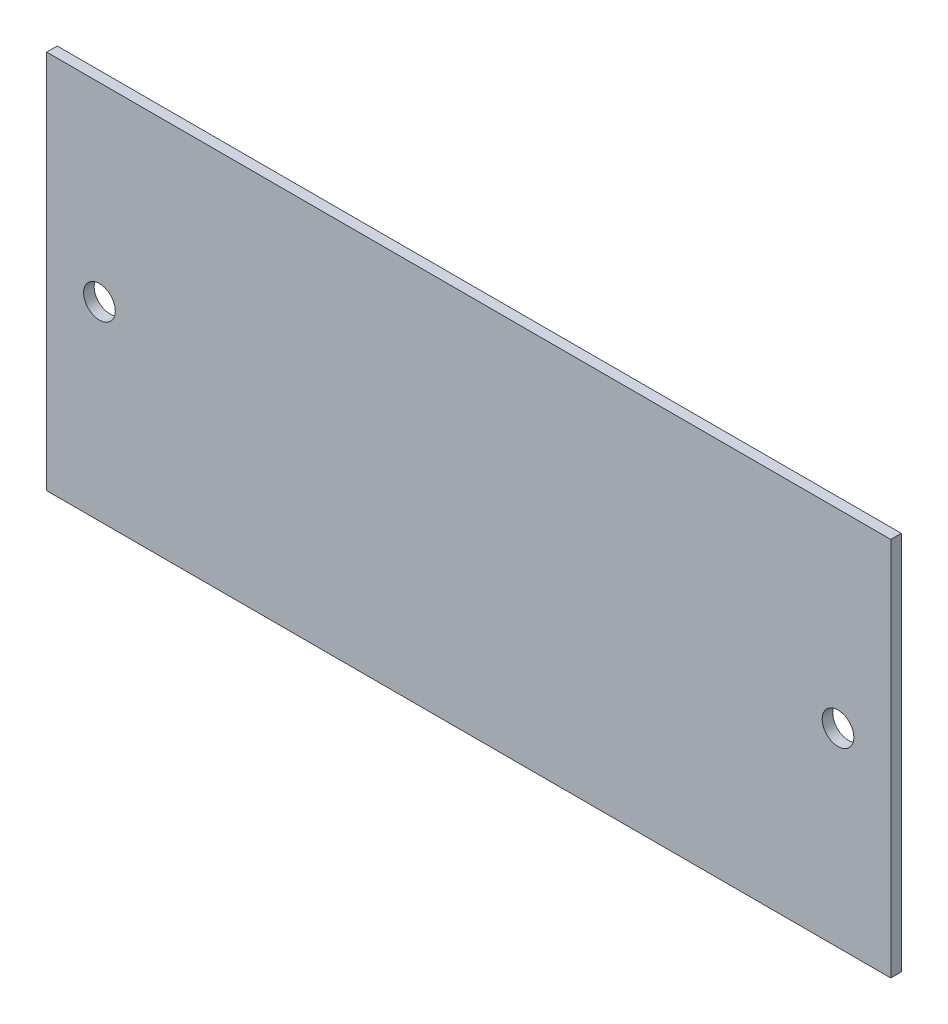
ISO-10303-21;
HEADER;
FILE_DESCRIPTION(('STEP AP214'),'2;1');
FILE_NAME('part.step','',(''),(''),'','','');
FILE_SCHEMA(('AUTOMOTIVE_DESIGN { 1 0 10303 214 1 1 1 1 }'));
ENDSEC;
DATA;
#1=APPLICATION_CONTEXT('core data for automotive mechanical design processes');
#2=APPLICATION_PROTOCOL_DEFINITION('international standard','automotive_design',2000,#1);
#3=PRODUCT_CONTEXT('',#1,'mechanical');
#4=PRODUCT('Part','Part','',(#3));
#5=PRODUCT_RELATED_PRODUCT_CATEGORY('part','',(#4));
#6=PRODUCT_DEFINITION_FORMATION('','',#4);
#7=PRODUCT_DEFINITION_CONTEXT('part definition',#1,'design');
#8=PRODUCT_DEFINITION('design','',#6,#7);
#9=PRODUCT_DEFINITION_SHAPE('','',#8);
#10=(LENGTH_UNIT() NAMED_UNIT(*) SI_UNIT(.MILLI.,.METRE.));
#11=(NAMED_UNIT(*) PLANE_ANGLE_UNIT() SI_UNIT($,.RADIAN.));
#12=(NAMED_UNIT(*) SI_UNIT($,.STERADIAN.) SOLID_ANGLE_UNIT());
#13=UNCERTAINTY_MEASURE_WITH_UNIT(LENGTH_MEASURE(1.E-05),#10,'distance_accuracy_value','');
#14=(GEOMETRIC_REPRESENTATION_CONTEXT(3) GLOBAL_UNCERTAINTY_ASSIGNED_CONTEXT((#13)) GLOBAL_UNIT_ASSIGNED_CONTEXT((#10,
#11,#12)) REPRESENTATION_CONTEXT('',''));
#15=CARTESIAN_POINT('',(0.,0.,0.));
#16=DIRECTION('',(0.,0.,1.));
#17=DIRECTION('',(1.,0.,0.));
#18=AXIS2_PLACEMENT_3D('',#15,#16,#17);
#19=CARTESIAN_POINT('',(0.,0.,1.27));
#20=DIRECTION('',(1.,0.,0.));
#21=DIRECTION('',(0.,0.,-1.));
#22=AXIS2_PLACEMENT_3D('',#19,#20,#21);
#23=PLANE('',#22);
#24=DIRECTION('',(0.,-1.,0.));
#25=VECTOR('',#24,1.);
#26=CARTESIAN_POINT('',(0.,0.,0.));
#27=LINE('',#26,#25);
#28=CARTESIAN_POINT('',(0.,45.72,0.));
#29=VERTEX_POINT('',#28);
#30=CARTESIAN_POINT('',(0.,0.,0.));
#31=VERTEX_POINT('',#30);
#32=EDGE_CURVE('E96',#29,#31,#27,.T.);
#33=ORIENTED_EDGE('',*,*,#32,.T.);
#34=DIRECTION('',(0.,0.,-1.));
#35=VECTOR('',#34,1.);
#36=CARTESIAN_POINT('',(0.,0.,1.27));
#37=LINE('',#36,#35);
#38=CARTESIAN_POINT('',(0.,0.,1.27));
#39=VERTEX_POINT('',#38);
#40=EDGE_CURVE('E11',#39,#31,#37,.T.);
#41=ORIENTED_EDGE('',*,*,#40,.F.);
#42=DIRECTION('',(0.,-1.,0.));
#43=VECTOR('',#42,1.);
#44=CARTESIAN_POINT('',(0.,0.,1.27));
#45=LINE('',#44,#43);
#46=CARTESIAN_POINT('',(0.,45.72,1.27));
#47=VERTEX_POINT('',#46);
#48=EDGE_CURVE('E84',#47,#39,#45,.T.);
#49=ORIENTED_EDGE('',*,*,#48,.F.);
#50=DIRECTION('',(0.,0.,-1.));
#51=VECTOR('',#50,1.);
#52=CARTESIAN_POINT('',(0.,45.72,1.27));
#53=LINE('',#52,#51);
#54=EDGE_CURVE('E92',#47,#29,#53,.T.);
#55=ORIENTED_EDGE('',*,*,#54,.T.);
#56=EDGE_LOOP('',(#33,#41,#49,#55));
#57=FACE_BOUND('',#56,.T.);
#58=ADVANCED_FACE('F33',(#57),#23,.F.);
#59=CARTESIAN_POINT('',(0.,0.,1.27));
#60=DIRECTION('',(0.,1.,0.));
#61=DIRECTION('',(0.,0.,1.));
#62=AXIS2_PLACEMENT_3D('',#59,#60,#61);
#63=PLANE('',#62);
#64=DIRECTION('',(1.,0.,0.));
#65=VECTOR('',#64,1.);
#66=CARTESIAN_POINT('',(0.,0.,0.));
#67=LINE('',#66,#65);
#68=CARTESIAN_POINT('',(101.6,0.,0.));
#69=VERTEX_POINT('',#68);
#70=EDGE_CURVE('E88',#31,#69,#67,.T.);
#71=ORIENTED_EDGE('',*,*,#70,.T.);
#72=DIRECTION('',(0.,0.,-1.));
#73=VECTOR('',#72,1.);
#74=CARTESIAN_POINT('',(101.6,0.,1.27));
#75=LINE('',#74,#73);
#76=CARTESIAN_POINT('',(101.6,0.,1.27));
#77=VERTEX_POINT('',#76);
#78=EDGE_CURVE('E41',#77,#69,#75,.T.);
#79=ORIENTED_EDGE('',*,*,#78,.F.);
#80=DIRECTION('',(1.,0.,0.));
#81=VECTOR('',#80,1.);
#82=CARTESIAN_POINT('',(0.,0.,1.27));
#83=LINE('',#82,#81);
#84=EDGE_CURVE('E79',#39,#77,#83,.T.);
#85=ORIENTED_EDGE('',*,*,#84,.F.);
#86=ORIENTED_EDGE('',*,*,#40,.T.);
#87=EDGE_LOOP('',(#71,#79,#85,#86));
#88=FACE_BOUND('',#87,.T.);
#89=ADVANCED_FACE('F87',(#88),#63,.F.);
#90=CARTESIAN_POINT('',(101.6,0.,1.27));
#91=DIRECTION('',(-1.,0.,0.));
#92=DIRECTION('',(0.,-1.,0.));
#93=AXIS2_PLACEMENT_3D('',#90,#91,#92);
#94=PLANE('',#93);
#95=DIRECTION('',(0.,1.,0.));
#96=VECTOR('',#95,1.);
#97=CARTESIAN_POINT('',(101.6,0.,0.));
#98=LINE('',#97,#96);
#99=CARTESIAN_POINT('',(101.6,45.72,0.));
#100=VERTEX_POINT('',#99);
#101=EDGE_CURVE('E66',#69,#100,#98,.T.);
#102=ORIENTED_EDGE('',*,*,#101,.T.);
#103=DIRECTION('',(0.,0.,-1.));
#104=VECTOR('',#103,1.);
#105=CARTESIAN_POINT('',(101.6,45.72,1.27));
#106=LINE('',#105,#104);
#107=CARTESIAN_POINT('',(101.6,45.72,1.27));
#108=VERTEX_POINT('',#107);
#109=EDGE_CURVE('E89',#108,#100,#106,.T.);
#110=ORIENTED_EDGE('',*,*,#109,.F.);
#111=DIRECTION('',(0.,1.,0.));
#112=VECTOR('',#111,1.);
#113=CARTESIAN_POINT('',(101.6,0.,1.27));
#114=LINE('',#113,#112);
#115=EDGE_CURVE('E82',#77,#108,#114,.T.);
#116=ORIENTED_EDGE('',*,*,#115,.F.);
#117=ORIENTED_EDGE('',*,*,#78,.T.);
#118=EDGE_LOOP('',(#102,#110,#116,#117));
#119=FACE_BOUND('',#118,.T.);
#120=ADVANCED_FACE('F90',(#119),#94,.F.);
#121=CARTESIAN_POINT('',(0.,45.72,1.27));
#122=DIRECTION('',(0.,-1.,0.));
#123=DIRECTION('',(0.,0.,-1.));
#124=AXIS2_PLACEMENT_3D('',#121,#122,#123);
#125=PLANE('',#124);
#126=DIRECTION('',(-1.,0.,0.));
#127=VECTOR('',#126,1.);
#128=CARTESIAN_POINT('',(0.,45.72,0.));
#129=LINE('',#128,#127);
#130=EDGE_CURVE('E72',#100,#29,#129,.T.);
#131=ORIENTED_EDGE('',*,*,#130,.T.);
#132=ORIENTED_EDGE('',*,*,#54,.F.);
#133=DIRECTION('',(-1.,0.,0.));
#134=VECTOR('',#133,1.);
#135=CARTESIAN_POINT('',(0.,45.72,1.27));
#136=LINE('',#135,#134);
#137=EDGE_CURVE('E49',#108,#47,#136,.T.);
#138=ORIENTED_EDGE('',*,*,#137,.F.);
#139=ORIENTED_EDGE('',*,*,#109,.T.);
#140=EDGE_LOOP('',(#131,#132,#138,#139));
#141=FACE_BOUND('',#140,.T.);
#142=ADVANCED_FACE('F104',(#141),#125,.F.);
#143=CARTESIAN_POINT('',(0.,0.,1.27));
#144=DIRECTION('',(0.,0.,-1.));
#145=DIRECTION('',(-1.,0.,0.));
#146=AXIS2_PLACEMENT_3D('',#143,#144,#145);
#147=PLANE('',#146);
#148=CARTESIAN_POINT('',(6.35,22.86,1.27));
#149=DIRECTION('',(0.,0.,1.));
#150=DIRECTION('',(1.,0.,0.));
#151=AXIS2_PLACEMENT_3D('',#148,#149,#150);
#152=CIRCLE('',#151,1.905);
#153=CARTESIAN_POINT('',(8.255,22.86,1.27));
#154=VERTEX_POINT('',#153);
#155=EDGE_CURVE('E99',#154,#154,#152,.T.);
#156=ORIENTED_EDGE('',*,*,#155,.F.);
#157=EDGE_LOOP('',(#156));
#158=FACE_BOUND('',#157,.T.);
#159=CARTESIAN_POINT('',(95.25,22.86,1.27));
#160=DIRECTION('',(0.,0.,1.));
#161=DIRECTION('',(-1.,0.,0.));
#162=AXIS2_PLACEMENT_3D('',#159,#160,#161);
#163=CIRCLE('',#162,1.90500000000001);
#164=CARTESIAN_POINT('',(93.345,22.86,1.27));
#165=VERTEX_POINT('',#164);
#166=EDGE_CURVE('E113',#165,#165,#163,.T.);
#167=ORIENTED_EDGE('',*,*,#166,.F.);
#168=EDGE_LOOP('',(#167));
#169=FACE_BOUND('',#168,.T.);
#170=ORIENTED_EDGE('',*,*,#48,.T.);
#171=ORIENTED_EDGE('',*,*,#84,.T.);
#172=ORIENTED_EDGE('',*,*,#115,.T.);
#173=ORIENTED_EDGE('',*,*,#137,.T.);
#174=EDGE_LOOP('',(#170,#171,#172,#173));
#175=FACE_BOUND('',#174,.T.);
#176=ADVANCED_FACE('F80',(#158,#169,#175),#147,.F.);
#177=CARTESIAN_POINT('',(0.,0.,0.));
#178=DIRECTION('',(0.,0.,-1.));
#179=DIRECTION('',(-1.,0.,0.));
#180=AXIS2_PLACEMENT_3D('',#177,#178,#179);
#181=PLANE('',#180);
#182=CARTESIAN_POINT('',(6.35,22.86,0.));
#183=DIRECTION('',(0.,0.,-1.));
#184=DIRECTION('',(-1.,0.,0.));
#185=AXIS2_PLACEMENT_3D('',#182,#183,#184);
#186=CIRCLE('',#185,1.905);
#187=CARTESIAN_POINT('',(4.445,22.86,0.));
#188=VERTEX_POINT('',#187);
#189=EDGE_CURVE('E116',#188,#188,#186,.F.);
#190=ORIENTED_EDGE('',*,*,#189,.T.);
#191=EDGE_LOOP('',(#190));
#192=FACE_BOUND('',#191,.T.);
#193=CARTESIAN_POINT('',(95.25,22.86,0.));
#194=DIRECTION('',(0.,0.,-1.));
#195=DIRECTION('',(-1.,0.,0.));
#196=AXIS2_PLACEMENT_3D('',#193,#194,#195);
#197=CIRCLE('',#196,1.90500000000001);
#198=CARTESIAN_POINT('',(93.345,22.86,0.));
#199=VERTEX_POINT('',#198);
#200=EDGE_CURVE('E110',#199,#199,#197,.F.);
#201=ORIENTED_EDGE('',*,*,#200,.T.);
#202=EDGE_LOOP('',(#201));
#203=FACE_BOUND('',#202,.T.);
#204=ORIENTED_EDGE('',*,*,#32,.F.);
#205=ORIENTED_EDGE('',*,*,#130,.F.);
#206=ORIENTED_EDGE('',*,*,#101,.F.);
#207=ORIENTED_EDGE('',*,*,#70,.F.);
#208=EDGE_LOOP('',(#204,#205,#206,#207));
#209=FACE_BOUND('',#208,.T.);
#210=ADVANCED_FACE('F107',(#192,#203,#209),#181,.T.);
#211=CARTESIAN_POINT('',(95.25,22.86,-0.000999999999999916));
#212=DIRECTION('',(0.,0.,1.));
#213=DIRECTION('',(1.,0.,0.));
#214=AXIS2_PLACEMENT_3D('',#211,#212,#213);
#215=CYLINDRICAL_SURFACE('',#214,1.90500000000001);
#216=ORIENTED_EDGE('',*,*,#200,.F.);
#217=EDGE_LOOP('',(#216));
#218=FACE_BOUND('',#217,.T.);
#219=ORIENTED_EDGE('',*,*,#166,.T.);
#220=EDGE_LOOP('',(#219));
#221=FACE_BOUND('',#220,.T.);
#222=ADVANCED_FACE('F129',(#218,#221),#215,.F.);
#223=CARTESIAN_POINT('',(6.35,22.86,-0.000999999999999916));
#224=DIRECTION('',(0.,0.,1.));
#225=DIRECTION('',(1.,0.,0.));
#226=AXIS2_PLACEMENT_3D('',#223,#224,#225);
#227=CYLINDRICAL_SURFACE('',#226,1.905);
#228=ORIENTED_EDGE('',*,*,#189,.F.);
#229=EDGE_LOOP('',(#228));
#230=FACE_BOUND('',#229,.T.);
#231=ORIENTED_EDGE('',*,*,#155,.T.);
#232=EDGE_LOOP('',(#231));
#233=FACE_BOUND('',#232,.T.);
#234=ADVANCED_FACE('F122',(#230,#233),#227,.F.);
#235=CLOSED_SHELL('',(#58,#89,#120,#142,#176,#210,#222,#234));
#236=MANIFOLD_SOLID_BREP('B2',#235);
#237=ADVANCED_BREP_SHAPE_REPRESENTATION('',(#18,#236),#14);
#238=SHAPE_DEFINITION_REPRESENTATION(#9,#237);
ENDSEC;
END-ISO-10303-21;
